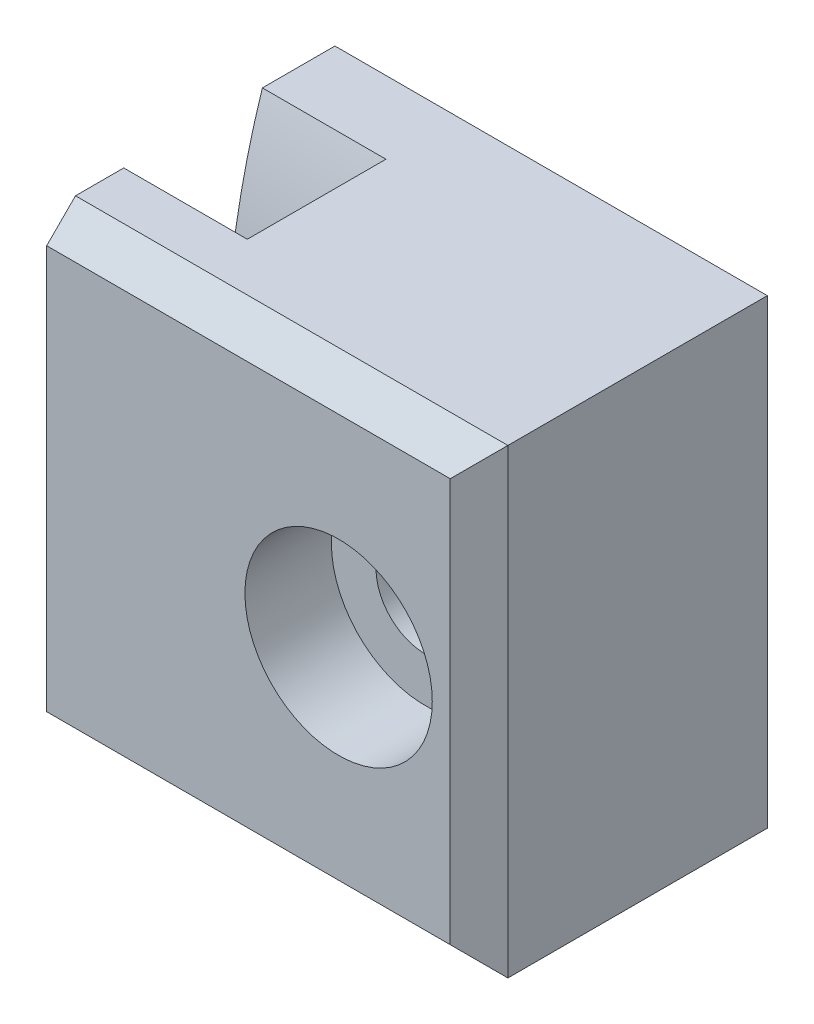
ISO-10303-21;
HEADER;
FILE_DESCRIPTION(('STEP AP214'),'2;1');
FILE_NAME('part.step','',(''),(''),'','','');
FILE_SCHEMA(('AUTOMOTIVE_DESIGN { 1 0 10303 214 1 1 1 1 }'));
ENDSEC;
DATA;
#1=APPLICATION_CONTEXT('core data for automotive mechanical design processes');
#2=APPLICATION_PROTOCOL_DEFINITION('international standard','automotive_design',2000,#1);
#3=PRODUCT_CONTEXT('',#1,'mechanical');
#4=PRODUCT('Part','Part','',(#3));
#5=PRODUCT_RELATED_PRODUCT_CATEGORY('part','',(#4));
#6=PRODUCT_DEFINITION_FORMATION('','',#4);
#7=PRODUCT_DEFINITION_CONTEXT('part definition',#1,'design');
#8=PRODUCT_DEFINITION('design','',#6,#7);
#9=PRODUCT_DEFINITION_SHAPE('','',#8);
#10=(LENGTH_UNIT() NAMED_UNIT(*) SI_UNIT(.MILLI.,.METRE.));
#11=(NAMED_UNIT(*) PLANE_ANGLE_UNIT() SI_UNIT($,.RADIAN.));
#12=(NAMED_UNIT(*) SI_UNIT($,.STERADIAN.) SOLID_ANGLE_UNIT());
#13=UNCERTAINTY_MEASURE_WITH_UNIT(LENGTH_MEASURE(1.E-05),#10,'distance_accuracy_value','');
#14=(GEOMETRIC_REPRESENTATION_CONTEXT(3) GLOBAL_UNCERTAINTY_ASSIGNED_CONTEXT((#13)) GLOBAL_UNIT_ASSIGNED_CONTEXT((#10,
#11,#12)) REPRESENTATION_CONTEXT('',''));
#15=CARTESIAN_POINT('',(0.,0.,0.));
#16=DIRECTION('',(0.,0.,1.));
#17=DIRECTION('',(1.,0.,0.));
#18=AXIS2_PLACEMENT_3D('',#15,#16,#17);
#19=CARTESIAN_POINT('',(0.,8.,9.99999999999991));
#20=DIRECTION('',(0.999999999999999,0.,0.));
#21=DIRECTION('',(0.,0.,-0.999999999999999));
#22=AXIS2_PLACEMENT_3D('',#19,#20,#21);
#23=PLANE('',#22);
#24=DIRECTION('',(0.,0.,-0.999999999999999));
#25=VECTOR('',#24,1.);
#26=CARTESIAN_POINT('',(0.,-8.,9.99999999999991));
#27=LINE('',#26,#25);
#28=CARTESIAN_POINT('',(0.,-8.,2.51673191701997));
#29=VERTEX_POINT('',#28);
#30=CARTESIAN_POINT('',(0.,-8.,0.));
#31=VERTEX_POINT('',#30);
#32=EDGE_CURVE('E178',#29,#31,#27,.T.);
#33=ORIENTED_EDGE('',*,*,#32,.F.);
#34=CARTESIAN_POINT('',(0.,0.,-22.0000000000003));
#35=DIRECTION('',(0.999999999999999,0.,0.));
#36=DIRECTION('',(0.,0.,-0.999999999999999));
#37=AXIS2_PLACEMENT_3D('',#34,#35,#36);
#38=CIRCLE('',#37,25.788953912306);
#39=CARTESIAN_POINT('',(0.,8.,2.51673191701997));
#40=VERTEX_POINT('',#39);
#41=EDGE_CURVE('E121',#29,#40,#38,.F.);
#42=ORIENTED_EDGE('',*,*,#41,.T.);
#43=DIRECTION('',(0.,0.,-0.999999999999999));
#44=VECTOR('',#43,1.);
#45=CARTESIAN_POINT('',(0.,8.,9.99999999999991));
#46=LINE('',#45,#44);
#47=CARTESIAN_POINT('',(0.,8.,0.));
#48=VERTEX_POINT('',#47);
#49=EDGE_CURVE('E159',#40,#48,#46,.T.);
#50=ORIENTED_EDGE('',*,*,#49,.T.);
#51=DIRECTION('',(0.,-1.,0.));
#52=VECTOR('',#51,1.);
#53=CARTESIAN_POINT('',(0.,8.,0.));
#54=LINE('',#53,#52);
#55=EDGE_CURVE('E155',#48,#31,#54,.T.);
#56=ORIENTED_EDGE('',*,*,#55,.T.);
#57=EDGE_LOOP('',(#33,#42,#50,#56));
#58=FACE_BOUND('',#57,.T.);
#59=ADVANCED_FACE('F32',(#58),#23,.F.);
#60=CARTESIAN_POINT('',(0.,8.,8.99999999999994));
#61=VERTEX_POINT('',#60);
#62=CARTESIAN_POINT('',(0.,8.,7.32589644997324));
#63=VERTEX_POINT('',#62);
#64=EDGE_CURVE('E171',#61,#63,#46,.T.);
#65=ORIENTED_EDGE('',*,*,#64,.T.);
#66=CARTESIAN_POINT('',(0.,0.,-22.0000000000003));
#67=DIRECTION('',(0.999999999999999,0.,0.));
#68=DIRECTION('',(0.,0.,-0.999999999999999));
#69=AXIS2_PLACEMENT_3D('',#66,#67,#68);
#70=CIRCLE('',#69,30.3975032296169);
#71=CARTESIAN_POINT('',(0.,-8.,7.32589644997325));
#72=VERTEX_POINT('',#71);
#73=EDGE_CURVE('E134',#63,#72,#70,.T.);
#74=ORIENTED_EDGE('',*,*,#73,.T.);
#75=CARTESIAN_POINT('',(0.,-8.,8.99999999999998));
#76=VERTEX_POINT('',#75);
#77=EDGE_CURVE('E133',#76,#72,#27,.T.);
#78=ORIENTED_EDGE('',*,*,#77,.F.);
#79=DIRECTION('',(0.,0.707106781186548,0.707106781186547));
#80=VECTOR('',#79,1.);
#81=CARTESIAN_POINT('',(0.,-7.,9.99999999999991));
#82=LINE('',#81,#80);
#83=CARTESIAN_POINT('',(0.,-7.,9.99999999999993));
#84=VERTEX_POINT('',#83);
#85=EDGE_CURVE('E188',#76,#84,#82,.T.);
#86=ORIENTED_EDGE('',*,*,#85,.T.);
#87=DIRECTION('',(0.,-1.,0.));
#88=VECTOR('',#87,1.);
#89=CARTESIAN_POINT('',(0.,8.,9.99999999999991));
#90=LINE('',#89,#88);
#91=CARTESIAN_POINT('',(0.,6.99999999999999,9.99999999999991));
#92=VERTEX_POINT('',#91);
#93=EDGE_CURVE('E156',#92,#84,#90,.T.);
#94=ORIENTED_EDGE('',*,*,#93,.F.);
#95=DIRECTION('',(0.,0.707106781186548,-0.707106781186548));
#96=VECTOR('',#95,1.);
#97=CARTESIAN_POINT('',(0.,6.99999999999999,9.99999999999991));
#98=LINE('',#97,#96);
#99=EDGE_CURVE('E186',#92,#61,#98,.T.);
#100=ORIENTED_EDGE('',*,*,#99,.T.);
#101=EDGE_LOOP('',(#65,#74,#78,#86,#94,#100));
#102=FACE_BOUND('',#101,.T.);
#103=ADVANCED_FACE('F219',(#102),#23,.F.);
#104=CARTESIAN_POINT('',(0.,-8.,9.99999999999991));
#105=DIRECTION('',(0.,1.,0.));
#106=DIRECTION('',(0.,0.,0.999999999999999));
#107=AXIS2_PLACEMENT_3D('',#104,#105,#106);
#108=PLANE('',#107);
#109=DIRECTION('',(0.,0.,-0.999999999999999));
#110=VECTOR('',#109,1.);
#111=CARTESIAN_POINT('',(4.28570155742139,-8.,9.99999999999995));
#112=LINE('',#111,#110);
#113=CARTESIAN_POINT('',(4.28570155742135,-8.,7.32589644997324));
#114=VERTEX_POINT('',#113);
#115=CARTESIAN_POINT('',(4.28570155742137,-8.,2.51673191702002));
#116=VERTEX_POINT('',#115);
#117=EDGE_CURVE('E111',#114,#116,#112,.T.);
#118=ORIENTED_EDGE('',*,*,#117,.T.);
#119=DIRECTION('',(-0.999999999999999,0.,0.));
#120=VECTOR('',#119,1.);
#121=CARTESIAN_POINT('',(6.58032539554299,-8.,2.51673191702004));
#122=LINE('',#121,#120);
#123=EDGE_CURVE('E141',#116,#29,#122,.T.);
#124=ORIENTED_EDGE('',*,*,#123,.T.);
#125=ORIENTED_EDGE('',*,*,#32,.T.);
#126=DIRECTION('',(0.999999999999999,0.,0.));
#127=VECTOR('',#126,1.);
#128=CARTESIAN_POINT('',(0.,-8.,0.));
#129=LINE('',#128,#127);
#130=CARTESIAN_POINT('',(15.,-8.,0.));
#131=VERTEX_POINT('',#130);
#132=EDGE_CURVE('E163',#31,#131,#129,.T.);
#133=ORIENTED_EDGE('',*,*,#132,.T.);
#134=DIRECTION('',(0.,0.,-0.999999999999999));
#135=VECTOR('',#134,1.);
#136=CARTESIAN_POINT('',(15.,-8.,9.99999999999999));
#137=LINE('',#136,#135);
#138=CARTESIAN_POINT('',(15.,-8.,8.99999999999999));
#139=VERTEX_POINT('',#138);
#140=EDGE_CURVE('E176',#139,#131,#137,.T.);
#141=ORIENTED_EDGE('',*,*,#140,.F.);
#142=DIRECTION('',(-0.999999999999999,0.,0.));
#143=VECTOR('',#142,1.);
#144=CARTESIAN_POINT('',(0.,-8.,8.99999999999998));
#145=LINE('',#144,#143);
#146=EDGE_CURVE('E184',#139,#76,#145,.T.);
#147=ORIENTED_EDGE('',*,*,#146,.T.);
#148=ORIENTED_EDGE('',*,*,#77,.T.);
#149=DIRECTION('',(-0.999999999999999,0.,0.));
#150=VECTOR('',#149,1.);
#151=CARTESIAN_POINT('',(6.58032539554303,-8.,7.32589644997321));
#152=LINE('',#151,#150);
#153=EDGE_CURVE('E122',#72,#114,#152,.F.);
#154=ORIENTED_EDGE('',*,*,#153,.T.);
#155=EDGE_LOOP('',(#118,#124,#125,#133,#141,#147,#148,#154));
#156=FACE_BOUND('',#155,.T.);
#157=ADVANCED_FACE('F131',(#156),#108,.F.);
#158=CARTESIAN_POINT('',(15.,8.,9.99999999999999));
#159=DIRECTION('',(-0.999999999999999,0.,0.));
#160=DIRECTION('',(0.,0.,0.999999999999999));
#161=AXIS2_PLACEMENT_3D('',#158,#159,#160);
#162=PLANE('',#161);
#163=DIRECTION('',(0.,0.,-0.999999999999999));
#164=VECTOR('',#163,1.);
#165=CARTESIAN_POINT('',(15.,8.,9.99999999999999));
#166=LINE('',#165,#164);
#167=CARTESIAN_POINT('',(15.,8.,8.99999999999999));
#168=VERTEX_POINT('',#167);
#169=CARTESIAN_POINT('',(15.,8.,0.));
#170=VERTEX_POINT('',#169);
#171=EDGE_CURVE('E174',#168,#170,#166,.T.);
#172=ORIENTED_EDGE('',*,*,#171,.F.);
#173=DIRECTION('',(0.,-1.,0.));
#174=VECTOR('',#173,1.);
#175=CARTESIAN_POINT('',(15.,-7.,8.99999999999999));
#176=LINE('',#175,#174);
#177=EDGE_CURVE('E40',#168,#139,#176,.T.);
#178=ORIENTED_EDGE('',*,*,#177,.T.);
#179=ORIENTED_EDGE('',*,*,#140,.T.);
#180=DIRECTION('',(0.,1.,0.));
#181=VECTOR('',#180,1.);
#182=CARTESIAN_POINT('',(15.,8.,0.));
#183=LINE('',#182,#181);
#184=EDGE_CURVE('E166',#131,#170,#183,.T.);
#185=ORIENTED_EDGE('',*,*,#184,.T.);
#186=EDGE_LOOP('',(#172,#178,#179,#185));
#187=FACE_BOUND('',#186,.T.);
#188=ADVANCED_FACE('F204',(#187),#162,.F.);
#189=CARTESIAN_POINT('',(0.,8.,9.99999999999991));
#190=DIRECTION('',(0.,-1.,0.));
#191=DIRECTION('',(0.,0.,-0.999999999999999));
#192=AXIS2_PLACEMENT_3D('',#189,#190,#191);
#193=PLANE('',#192);
#194=ORIENTED_EDGE('',*,*,#49,.F.);
#195=DIRECTION('',(-0.999999999999999,0.,0.));
#196=VECTOR('',#195,1.);
#197=CARTESIAN_POINT('',(6.58032539554299,8.,2.51673191701997));
#198=LINE('',#197,#196);
#199=CARTESIAN_POINT('',(4.28570155742138,8.,2.51673191702002));
#200=VERTEX_POINT('',#199);
#201=EDGE_CURVE('E196',#40,#200,#198,.F.);
#202=ORIENTED_EDGE('',*,*,#201,.T.);
#203=DIRECTION('',(0.,0.,0.999999999999999));
#204=VECTOR('',#203,1.);
#205=CARTESIAN_POINT('',(4.28570155742139,8.,9.99999999999995));
#206=LINE('',#205,#204);
#207=CARTESIAN_POINT('',(4.28570155742135,8.,7.32589644997324));
#208=VERTEX_POINT('',#207);
#209=EDGE_CURVE('E194',#200,#208,#206,.T.);
#210=ORIENTED_EDGE('',*,*,#209,.T.);
#211=DIRECTION('',(-0.999999999999999,0.,0.));
#212=VECTOR('',#211,1.);
#213=CARTESIAN_POINT('',(6.58032539554303,8.,7.32589644997321));
#214=LINE('',#213,#212);
#215=EDGE_CURVE('E128',#208,#63,#214,.T.);
#216=ORIENTED_EDGE('',*,*,#215,.T.);
#217=ORIENTED_EDGE('',*,*,#64,.F.);
#218=DIRECTION('',(0.999999999999999,0.,0.));
#219=VECTOR('',#218,1.);
#220=CARTESIAN_POINT('',(15.,8.,8.99999999999999));
#221=LINE('',#220,#219);
#222=EDGE_CURVE('E190',#61,#168,#221,.T.);
#223=ORIENTED_EDGE('',*,*,#222,.T.);
#224=ORIENTED_EDGE('',*,*,#171,.T.);
#225=DIRECTION('',(-0.999999999999999,0.,0.));
#226=VECTOR('',#225,1.);
#227=CARTESIAN_POINT('',(0.,8.,0.));
#228=LINE('',#227,#226);
#229=EDGE_CURVE('E160',#170,#48,#228,.T.);
#230=ORIENTED_EDGE('',*,*,#229,.T.);
#231=EDGE_LOOP('',(#194,#202,#210,#216,#217,#223,#224,#230));
#232=FACE_BOUND('',#231,.T.);
#233=ADVANCED_FACE('F222',(#232),#193,.F.);
#234=CARTESIAN_POINT('',(0.,-8.,9.99999999999991));
#235=DIRECTION('',(0.,0.,0.999999999999999));
#236=DIRECTION('',(0.999999999999999,0.,0.));
#237=AXIS2_PLACEMENT_3D('',#234,#235,#236);
#238=PLANE('',#237);
#239=CARTESIAN_POINT('',(10.1268774956348,0.,9.99999999999999));
#240=DIRECTION('',(0.,0.,0.999999999999999));
#241=DIRECTION('',(0.999999999999999,0.,0.));
#242=AXIS2_PLACEMENT_3D('',#239,#240,#241);
#243=CIRCLE('',#242,3.25);
#244=CARTESIAN_POINT('',(13.3768774956348,0.,9.99999999999999));
#245=VERTEX_POINT('',#244);
#246=EDGE_CURVE('E152',#245,#245,#243,.T.);
#247=ORIENTED_EDGE('',*,*,#246,.F.);
#248=EDGE_LOOP('',(#247));
#249=FACE_BOUND('',#248,.T.);
#250=DIRECTION('',(0.999999999999999,0.,0.));
#251=VECTOR('',#250,1.);
#252=CARTESIAN_POINT('',(15.,-7.,9.99999999999999));
#253=LINE('',#252,#251);
#254=CARTESIAN_POINT('',(14.,-7.,9.99999999999999));
#255=VERTEX_POINT('',#254);
#256=EDGE_CURVE('E182',#84,#255,#253,.T.);
#257=ORIENTED_EDGE('',*,*,#256,.T.);
#258=DIRECTION('',(0.,1.,0.));
#259=VECTOR('',#258,1.);
#260=CARTESIAN_POINT('',(14.,6.99999999999999,9.99999999999991));
#261=LINE('',#260,#259);
#262=CARTESIAN_POINT('',(14.,6.99999999999999,9.99999999999991));
#263=VERTEX_POINT('',#262);
#264=EDGE_CURVE('E199',#255,#263,#261,.T.);
#265=ORIENTED_EDGE('',*,*,#264,.T.);
#266=DIRECTION('',(-0.999999999999999,0.,0.));
#267=VECTOR('',#266,1.);
#268=CARTESIAN_POINT('',(0.,6.99999999999999,9.99999999999991));
#269=LINE('',#268,#267);
#270=EDGE_CURVE('E180',#263,#92,#269,.T.);
#271=ORIENTED_EDGE('',*,*,#270,.T.);
#272=ORIENTED_EDGE('',*,*,#93,.T.);
#273=EDGE_LOOP('',(#257,#265,#271,#272));
#274=FACE_BOUND('',#273,.T.);
#275=ADVANCED_FACE('F211',(#249,#274),#238,.T.);
#276=CARTESIAN_POINT('',(0.,-8.,0.));
#277=DIRECTION('',(0.,0.,0.999999999999999));
#278=DIRECTION('',(0.999999999999999,0.,0.));
#279=AXIS2_PLACEMENT_3D('',#276,#277,#278);
#280=PLANE('',#279);
#281=CARTESIAN_POINT('',(10.1268774956348,0.,0.));
#282=DIRECTION('',(0.,0.,0.999999999999999));
#283=DIRECTION('',(0.999999999999999,0.,0.));
#284=AXIS2_PLACEMENT_3D('',#281,#282,#283);
#285=CIRCLE('',#284,1.7);
#286=CARTESIAN_POINT('',(11.8268774956348,0.,0.));
#287=VERTEX_POINT('',#286);
#288=EDGE_CURVE('E143',#287,#287,#285,.T.);
#289=ORIENTED_EDGE('',*,*,#288,.T.);
#290=EDGE_LOOP('',(#289));
#291=FACE_BOUND('',#290,.T.);
#292=ORIENTED_EDGE('',*,*,#55,.F.);
#293=ORIENTED_EDGE('',*,*,#229,.F.);
#294=ORIENTED_EDGE('',*,*,#184,.F.);
#295=ORIENTED_EDGE('',*,*,#132,.F.);
#296=EDGE_LOOP('',(#292,#293,#294,#295));
#297=FACE_BOUND('',#296,.T.);
#298=ADVANCED_FACE('F230',(#291,#297),#280,.F.);
#299=CARTESIAN_POINT('',(0.,-7.,9.99999999999991));
#300=DIRECTION('',(0.,-0.707106781186547,0.707106781186547));
#301=DIRECTION('',(0.,-0.707106781186548,-0.707106781186547));
#302=AXIS2_PLACEMENT_3D('',#299,#300,#301);
#303=PLANE('',#302);
#304=ORIENTED_EDGE('',*,*,#146,.F.);
#305=DIRECTION('',(-0.577350269189623,0.577350269189626,0.577350269189626));
#306=VECTOR('',#305,1.);
#307=CARTESIAN_POINT('',(9.33333333333335,-2.33333333333335,14.6666666666666));
#308=LINE('',#307,#306);
#309=EDGE_CURVE('E11',#139,#255,#308,.T.);
#310=ORIENTED_EDGE('',*,*,#309,.T.);
#311=ORIENTED_EDGE('',*,*,#256,.F.);
#312=ORIENTED_EDGE('',*,*,#85,.F.);
#313=EDGE_LOOP('',(#304,#310,#311,#312));
#314=FACE_BOUND('',#313,.T.);
#315=ADVANCED_FACE('F208',(#314),#303,.T.);
#316=CARTESIAN_POINT('',(0.,6.99999999999999,9.99999999999991));
#317=DIRECTION('',(0.,0.707106781186547,0.707106781186547));
#318=DIRECTION('',(0.,-0.707106781186548,0.707106781186548));
#319=AXIS2_PLACEMENT_3D('',#316,#317,#318);
#320=PLANE('',#319);
#321=ORIENTED_EDGE('',*,*,#270,.F.);
#322=DIRECTION('',(0.577350269189624,0.577350269189626,-0.577350269189626));
#323=VECTOR('',#322,1.);
#324=CARTESIAN_POINT('',(9.33333333333335,2.33333333333334,14.6666666666666));
#325=LINE('',#324,#323);
#326=EDGE_CURVE('E47',#263,#168,#325,.T.);
#327=ORIENTED_EDGE('',*,*,#326,.T.);
#328=ORIENTED_EDGE('',*,*,#222,.F.);
#329=ORIENTED_EDGE('',*,*,#99,.F.);
#330=EDGE_LOOP('',(#321,#327,#328,#329));
#331=FACE_BOUND('',#330,.T.);
#332=ADVANCED_FACE('F214',(#331),#320,.T.);
#333=CARTESIAN_POINT('',(10.1268774956348,0.,9.99999999999999));
#334=DIRECTION('',(0.,0.,0.999999999999999));
#335=DIRECTION('',(0.999999999999999,0.,0.));
#336=AXIS2_PLACEMENT_3D('',#333,#334,#335);
#337=CYLINDRICAL_SURFACE('',#336,3.25);
#338=CARTESIAN_POINT('',(10.1268774956348,0.,6.99999999999999));
#339=DIRECTION('',(0.,0.,0.999999999999999));
#340=DIRECTION('',(0.999999999999999,0.,0.));
#341=AXIS2_PLACEMENT_3D('',#338,#339,#340);
#342=CIRCLE('',#341,3.25);
#343=CARTESIAN_POINT('',(13.3768774956348,0.,6.99999999999999));
#344=VERTEX_POINT('',#343);
#345=EDGE_CURVE('E149',#344,#344,#342,.T.);
#346=CARTESIAN_POINT('',(13.3768774956348,0.,6.99999999999999));
#347=CARTESIAN_POINT('',(13.3768774956348,0.,7.03124999999999));
#348=CARTESIAN_POINT('',(13.3768774956348,0.,7.06249999999999));
#349=CARTESIAN_POINT('',(13.3768774956348,0.,7.12499999999999));
#350=CARTESIAN_POINT('',(13.3768774956348,0.,7.15624999999999));
#351=CARTESIAN_POINT('',(13.3768774956348,0.,7.21874999999999));
#352=CARTESIAN_POINT('',(13.3768774956348,0.,7.24999999999999));
#353=CARTESIAN_POINT('',(13.3768774956348,0.,7.31249999999999));
#354=CARTESIAN_POINT('',(13.3768774956348,0.,7.34374999999999));
#355=CARTESIAN_POINT('',(13.3768774956348,0.,7.40624999999999));
#356=CARTESIAN_POINT('',(13.3768774956348,0.,7.43749999999999));
#357=CARTESIAN_POINT('',(13.3768774956348,0.,7.49999999999999));
#358=CARTESIAN_POINT('',(13.3768774956348,0.,7.53124999999999));
#359=CARTESIAN_POINT('',(13.3768774956348,0.,7.59374999999999));
#360=CARTESIAN_POINT('',(13.3768774956348,0.,7.62499999999999));
#361=CARTESIAN_POINT('',(13.3768774956348,0.,7.68749999999999));
#362=CARTESIAN_POINT('',(13.3768774956348,0.,7.71874999999999));
#363=CARTESIAN_POINT('',(13.3768774956348,0.,7.78124999999999));
#364=CARTESIAN_POINT('',(13.3768774956348,0.,7.81249999999999));
#365=CARTESIAN_POINT('',(13.3768774956348,0.,7.87499999999999));
#366=CARTESIAN_POINT('',(13.3768774956348,0.,7.90624999999999));
#367=CARTESIAN_POINT('',(13.3768774956348,0.,7.96874999999999));
#368=CARTESIAN_POINT('',(13.3768774956348,0.,7.99999999999999));
#369=CARTESIAN_POINT('',(13.3768774956348,0.,8.06249999999999));
#370=CARTESIAN_POINT('',(13.3768774956348,0.,8.09374999999999));
#371=CARTESIAN_POINT('',(13.3768774956348,0.,8.15624999999999));
#372=CARTESIAN_POINT('',(13.3768774956348,0.,8.18749999999999));
#373=CARTESIAN_POINT('',(13.3768774956348,0.,8.24999999999999));
#374=CARTESIAN_POINT('',(13.3768774956348,0.,8.28124999999999));
#375=CARTESIAN_POINT('',(13.3768774956348,0.,8.34374999999999));
#376=CARTESIAN_POINT('',(13.3768774956348,0.,8.37499999999999));
#377=CARTESIAN_POINT('',(13.3768774956348,0.,8.43749999999999));
#378=CARTESIAN_POINT('',(13.3768774956348,0.,8.46874999999999));
#379=CARTESIAN_POINT('',(13.3768774956348,0.,8.53124999999999));
#380=CARTESIAN_POINT('',(13.3768774956348,0.,8.56249999999999));
#381=CARTESIAN_POINT('',(13.3768774956348,0.,8.62499999999999));
#382=CARTESIAN_POINT('',(13.3768774956348,0.,8.65624999999999));
#383=CARTESIAN_POINT('',(13.3768774956348,0.,8.71874999999999));
#384=CARTESIAN_POINT('',(13.3768774956348,0.,8.74999999999999));
#385=CARTESIAN_POINT('',(13.3768774956348,0.,8.81249999999999));
#386=CARTESIAN_POINT('',(13.3768774956348,0.,8.84374999999999));
#387=CARTESIAN_POINT('',(13.3768774956348,0.,8.90624999999999));
#388=CARTESIAN_POINT('',(13.3768774956348,0.,8.93749999999999));
#389=CARTESIAN_POINT('',(13.3768774956348,0.,8.99999999999999));
#390=CARTESIAN_POINT('',(13.3768774956348,0.,9.03124999999999));
#391=CARTESIAN_POINT('',(13.3768774956348,0.,9.09374999999999));
#392=CARTESIAN_POINT('',(13.3768774956348,0.,9.12499999999999));
#393=CARTESIAN_POINT('',(13.3768774956348,0.,9.18749999999999));
#394=CARTESIAN_POINT('',(13.3768774956348,0.,9.21874999999999));
#395=CARTESIAN_POINT('',(13.3768774956348,0.,9.28124999999999));
#396=CARTESIAN_POINT('',(13.3768774956348,0.,9.31249999999999));
#397=CARTESIAN_POINT('',(13.3768774956348,0.,9.37499999999999));
#398=CARTESIAN_POINT('',(13.3768774956348,0.,9.40624999999999));
#399=CARTESIAN_POINT('',(13.3768774956348,0.,9.46874999999999));
#400=CARTESIAN_POINT('',(13.3768774956348,0.,9.49999999999999));
#401=CARTESIAN_POINT('',(13.3768774956348,0.,9.56249999999999));
#402=CARTESIAN_POINT('',(13.3768774956348,0.,9.59374999999999));
#403=CARTESIAN_POINT('',(13.3768774956348,0.,9.65624999999999));
#404=CARTESIAN_POINT('',(13.3768774956348,0.,9.68749999999999));
#405=CARTESIAN_POINT('',(13.3768774956348,0.,9.74999999999999));
#406=CARTESIAN_POINT('',(13.3768774956348,0.,9.78124999999999));
#407=CARTESIAN_POINT('',(13.3768774956348,0.,9.84374999999999));
#408=CARTESIAN_POINT('',(13.3768774956348,0.,9.87499999999999));
#409=CARTESIAN_POINT('',(13.3768774956348,0.,9.93749999999999));
#410=CARTESIAN_POINT('',(13.3768774956348,0.,9.96874999999999));
#411=CARTESIAN_POINT('',(13.3768774956348,0.,9.99999999999999));
#412=B_SPLINE_CURVE_WITH_KNOTS('',3,(#346,#347,#348,#349,#350,#351,#352,#353,#354,#355,#356,
#357,#358,#359,#360,#361,#362,#363,#364,#365,#366,#367,#368,#369,#370,#371,#372,#373,#374,#375,
#376,#377,#378,#379,#380,#381,#382,#383,#384,#385,#386,#387,#388,#389,#390,#391,#392,#393,#394,
#395,#396,#397,#398,#399,#400,#401,#402,#403,#404,#405,#406,#407,#408,#409,#410,#411),
.UNSPECIFIED.,.F.,.F.,(4,2,2,2,2,2,2,2,2,2,2,2,2,2,2,2,2,2,2,2,2,2,2,2,2,2,2,2,2,2,2,2,4),(0.,
0.0937499999999992,0.187499999999999,0.281249999999999,0.374999999999999,0.46875,0.5625,
0.656250000000001,0.75,0.843750000000001,0.937500000000001,1.03125,1.125,1.21875,1.3125,1.40625,
1.5,1.59375,1.6875,1.78125,1.875,1.96875,2.0625,2.15625,2.25,2.34375,2.4375,2.53125,2.625,
2.71875,2.8125,2.90625,3.),.UNSPECIFIED.);
#413=EDGE_CURVE('BSEAM250',#344,#245,#412,.T.);
#414=ORIENTED_EDGE('',*,*,#345,.F.);
#415=ORIENTED_EDGE('',*,*,#246,.T.);
#416=ORIENTED_EDGE('',*,*,#413,.T.);
#417=ORIENTED_EDGE('',*,*,#413,.F.);
#418=EDGE_LOOP('',(#414,#416,#415,#417));
#419=FACE_BOUND('',#418,.T.);
#420=ADVANCED_FACE('F250',(#419),#337,.F.);
#421=CARTESIAN_POINT('',(11.8268774956349,0.,6.99999999999995));
#422=DIRECTION('',(0.,0.,-0.999999999999999));
#423=DIRECTION('',(-0.999999999999999,0.,0.));
#424=AXIS2_PLACEMENT_3D('',#421,#422,#423);
#425=PLANE('',#424);
#426=CARTESIAN_POINT('',(10.1268774956348,0.,6.99999999999999));
#427=DIRECTION('',(0.,0.,0.999999999999999));
#428=DIRECTION('',(0.999999999999999,0.,0.));
#429=AXIS2_PLACEMENT_3D('',#426,#427,#428);
#430=CIRCLE('',#429,1.7);
#431=CARTESIAN_POINT('',(11.8268774956348,0.,6.99999999999999));
#432=VERTEX_POINT('',#431);
#433=EDGE_CURVE('E146',#432,#432,#430,.T.);
#434=ORIENTED_EDGE('',*,*,#433,.F.);
#435=EDGE_LOOP('',(#434));
#436=FACE_BOUND('',#435,.T.);
#437=ORIENTED_EDGE('',*,*,#345,.T.);
#438=EDGE_LOOP('',(#437));
#439=FACE_BOUND('',#438,.T.);
#440=ADVANCED_FACE('F254',(#436,#439),#425,.F.);
#441=CARTESIAN_POINT('',(10.1268774956348,0.,9.99999999999999));
#442=DIRECTION('',(0.,0.,0.999999999999999));
#443=DIRECTION('',(0.999999999999999,0.,0.));
#444=AXIS2_PLACEMENT_3D('',#441,#442,#443);
#445=CYLINDRICAL_SURFACE('',#444,1.7);
#446=CARTESIAN_POINT('',(11.8268774956348,0.,0.));
#447=CARTESIAN_POINT('',(11.8268774956348,0.,0.0729166666666666));
#448=CARTESIAN_POINT('',(11.8268774956348,0.,0.145833333333333));
#449=CARTESIAN_POINT('',(11.8268774956348,0.,0.291666666666667));
#450=CARTESIAN_POINT('',(11.8268774956348,0.,0.364583333333334));
#451=CARTESIAN_POINT('',(11.8268774956348,0.,0.510416666666667));
#452=CARTESIAN_POINT('',(11.8268774956348,0.,0.583333333333334));
#453=CARTESIAN_POINT('',(11.8268774956348,0.,0.729166666666667));
#454=CARTESIAN_POINT('',(11.8268774956348,0.,0.802083333333333));
#455=CARTESIAN_POINT('',(11.8268774956348,0.,0.947916666666665));
#456=CARTESIAN_POINT('',(11.8268774956348,0.,1.02083333333333));
#457=CARTESIAN_POINT('',(11.8268774956348,0.,1.16666666666666));
#458=CARTESIAN_POINT('',(11.8268774956348,0.,1.23958333333333));
#459=CARTESIAN_POINT('',(11.8268774956348,0.,1.38541666666666));
#460=CARTESIAN_POINT('',(11.8268774956348,0.,1.45833333333333));
#461=CARTESIAN_POINT('',(11.8268774956348,0.,1.60416666666666));
#462=CARTESIAN_POINT('',(11.8268774956348,0.,1.67708333333333));
#463=CARTESIAN_POINT('',(11.8268774956348,0.,1.82291666666666));
#464=CARTESIAN_POINT('',(11.8268774956348,0.,1.89583333333333));
#465=CARTESIAN_POINT('',(11.8268774956348,0.,2.04166666666666));
#466=CARTESIAN_POINT('',(11.8268774956348,0.,2.11458333333333));
#467=CARTESIAN_POINT('',(11.8268774956348,0.,2.26041666666666));
#468=CARTESIAN_POINT('',(11.8268774956348,0.,2.33333333333333));
#469=CARTESIAN_POINT('',(11.8268774956348,0.,2.47916666666666));
#470=CARTESIAN_POINT('',(11.8268774956348,0.,2.55208333333333));
#471=CARTESIAN_POINT('',(11.8268774956348,0.,2.69791666666666));
#472=CARTESIAN_POINT('',(11.8268774956348,0.,2.77083333333333));
#473=CARTESIAN_POINT('',(11.8268774956348,0.,2.91666666666666));
#474=CARTESIAN_POINT('',(11.8268774956348,0.,2.98958333333333));
#475=CARTESIAN_POINT('',(11.8268774956348,0.,3.13541666666666));
#476=CARTESIAN_POINT('',(11.8268774956348,0.,3.20833333333333));
#477=CARTESIAN_POINT('',(11.8268774956348,0.,3.35416666666666));
#478=CARTESIAN_POINT('',(11.8268774956348,0.,3.42708333333333));
#479=CARTESIAN_POINT('',(11.8268774956348,0.,3.57291666666666));
#480=CARTESIAN_POINT('',(11.8268774956348,0.,3.64583333333333));
#481=CARTESIAN_POINT('',(11.8268774956348,0.,3.79166666666666));
#482=CARTESIAN_POINT('',(11.8268774956348,0.,3.86458333333333));
#483=CARTESIAN_POINT('',(11.8268774956348,0.,4.01041666666666));
#484=CARTESIAN_POINT('',(11.8268774956348,0.,4.08333333333333));
#485=CARTESIAN_POINT('',(11.8268774956348,0.,4.22916666666666));
#486=CARTESIAN_POINT('',(11.8268774956348,0.,4.30208333333333));
#487=CARTESIAN_POINT('',(11.8268774956348,0.,4.44791666666666));
#488=CARTESIAN_POINT('',(11.8268774956348,0.,4.52083333333333));
#489=CARTESIAN_POINT('',(11.8268774956348,0.,4.66666666666666));
#490=CARTESIAN_POINT('',(11.8268774956348,0.,4.73958333333333));
#491=CARTESIAN_POINT('',(11.8268774956348,0.,4.88541666666666));
#492=CARTESIAN_POINT('',(11.8268774956348,0.,4.95833333333333));
#493=CARTESIAN_POINT('',(11.8268774956348,0.,5.10416666666666));
#494=CARTESIAN_POINT('',(11.8268774956348,0.,5.17708333333333));
#495=CARTESIAN_POINT('',(11.8268774956348,0.,5.32291666666666));
#496=CARTESIAN_POINT('',(11.8268774956348,0.,5.39583333333333));
#497=CARTESIAN_POINT('',(11.8268774956348,0.,5.54166666666666));
#498=CARTESIAN_POINT('',(11.8268774956348,0.,5.61458333333333));
#499=CARTESIAN_POINT('',(11.8268774956348,0.,5.76041666666666));
#500=CARTESIAN_POINT('',(11.8268774956348,0.,5.83333333333333));
#501=CARTESIAN_POINT('',(11.8268774956348,0.,5.97916666666666));
#502=CARTESIAN_POINT('',(11.8268774956348,0.,6.05208333333333));
#503=CARTESIAN_POINT('',(11.8268774956348,0.,6.19791666666666));
#504=CARTESIAN_POINT('',(11.8268774956348,0.,6.27083333333333));
#505=CARTESIAN_POINT('',(11.8268774956348,0.,6.41666666666666));
#506=CARTESIAN_POINT('',(11.8268774956348,0.,6.48958333333333));
#507=CARTESIAN_POINT('',(11.8268774956348,0.,6.63541666666666));
#508=CARTESIAN_POINT('',(11.8268774956348,0.,6.70833333333333));
#509=CARTESIAN_POINT('',(11.8268774956348,0.,6.85416666666666));
#510=CARTESIAN_POINT('',(11.8268774956348,0.,6.92708333333333));
#511=CARTESIAN_POINT('',(11.8268774956348,0.,6.99999999999999));
#512=B_SPLINE_CURVE_WITH_KNOTS('',3,(#446,#447,#448,#449,#450,#451,#452,#453,#454,#455,#456,
#457,#458,#459,#460,#461,#462,#463,#464,#465,#466,#467,#468,#469,#470,#471,#472,#473,#474,#475,
#476,#477,#478,#479,#480,#481,#482,#483,#484,#485,#486,#487,#488,#489,#490,#491,#492,#493,#494,
#495,#496,#497,#498,#499,#500,#501,#502,#503,#504,#505,#506,#507,#508,#509,#510,#511),
.UNSPECIFIED.,.F.,.F.,(4,2,2,2,2,2,2,2,2,2,2,2,2,2,2,2,2,2,2,2,2,2,2,2,2,2,2,2,2,2,2,2,4),(0.,
0.21875,0.4375,0.656250000000001,0.874999999999999,1.09375,1.3125,1.53125,1.75,1.96875,2.1875,
2.40625,2.625,2.84375,3.0625,3.28125,3.5,3.71875,3.9375,4.15624999999999,4.37499999999999,
4.59374999999999,4.81249999999999,5.03124999999999,5.24999999999999,5.46874999999999,
5.68749999999999,5.90624999999999,6.12499999999999,6.34374999999999,6.56249999999999,
6.78124999999999,6.99999999999999),.UNSPECIFIED.);
#513=EDGE_CURVE('BSEAM260',#287,#432,#512,.T.);
#514=ORIENTED_EDGE('',*,*,#288,.F.);
#515=ORIENTED_EDGE('',*,*,#433,.T.);
#516=ORIENTED_EDGE('',*,*,#513,.T.);
#517=ORIENTED_EDGE('',*,*,#513,.F.);
#518=EDGE_LOOP('',(#514,#516,#515,#517));
#519=FACE_BOUND('',#518,.T.);
#520=ADVANCED_FACE('F260',(#519),#445,.F.);
#521=CARTESIAN_POINT('',(6.58032539554299,0.,-22.0000000000003));
#522=DIRECTION('',(-0.999999999999999,0.,0.));
#523=DIRECTION('',(0.,0.,0.999999999999999));
#524=AXIS2_PLACEMENT_3D('',#521,#522,#523);
#525=CYLINDRICAL_SURFACE('',#524,25.788953912306);
#526=CARTESIAN_POINT('',(4.28570155742135,0.,-22.0000000000003));
#527=DIRECTION('',(-0.999999999999999,0.,0.));
#528=DIRECTION('',(0.,0.,0.999999999999999));
#529=AXIS2_PLACEMENT_3D('',#526,#527,#528);
#530=CIRCLE('',#529,25.788953912306);
#531=EDGE_CURVE('E117',#116,#200,#530,.T.);
#532=ORIENTED_EDGE('',*,*,#531,.T.);
#533=ORIENTED_EDGE('',*,*,#201,.F.);
#534=ORIENTED_EDGE('',*,*,#41,.F.);
#535=ORIENTED_EDGE('',*,*,#123,.F.);
#536=EDGE_LOOP('',(#532,#533,#534,#535));
#537=FACE_BOUND('',#536,.T.);
#538=ADVANCED_FACE('F224',(#537),#525,.T.);
#539=CARTESIAN_POINT('',(4.28570155742136,-10.1468950816268,6.6539477698451));
#540=DIRECTION('',(0.999999999999999,0.,0.));
#541=DIRECTION('',(0.,0.,-0.999999999999999));
#542=AXIS2_PLACEMENT_3D('',#539,#540,#541);
#543=PLANE('',#542);
#544=CARTESIAN_POINT('',(4.28570155742135,0.,-22.0000000000003));
#545=DIRECTION('',(-0.999999999999999,0.,0.));
#546=DIRECTION('',(0.,0.,0.999999999999999));
#547=AXIS2_PLACEMENT_3D('',#544,#545,#546);
#548=CIRCLE('',#547,30.3975032296169);
#549=EDGE_CURVE('E114',#114,#208,#548,.T.);
#550=ORIENTED_EDGE('',*,*,#549,.T.);
#551=ORIENTED_EDGE('',*,*,#209,.F.);
#552=ORIENTED_EDGE('',*,*,#531,.F.);
#553=ORIENTED_EDGE('',*,*,#117,.F.);
#554=EDGE_LOOP('',(#550,#551,#552,#553));
#555=FACE_BOUND('',#554,.T.);
#556=ADVANCED_FACE('F113',(#555),#543,.F.);
#557=CARTESIAN_POINT('',(6.58032539554299,0.,-22.0000000000003));
#558=DIRECTION('',(-0.999999999999999,0.,0.));
#559=DIRECTION('',(0.,0.,0.999999999999999));
#560=AXIS2_PLACEMENT_3D('',#557,#558,#559);
#561=CYLINDRICAL_SURFACE('',#560,30.3975032296169);
#562=ORIENTED_EDGE('',*,*,#73,.F.);
#563=ORIENTED_EDGE('',*,*,#215,.F.);
#564=ORIENTED_EDGE('',*,*,#549,.F.);
#565=ORIENTED_EDGE('',*,*,#153,.F.);
#566=EDGE_LOOP('',(#562,#563,#564,#565));
#567=FACE_BOUND('',#566,.T.);
#568=ADVANCED_FACE('F125',(#567),#561,.F.);
#569=CARTESIAN_POINT('',(14.,-8.,9.99999999999991));
#570=DIRECTION('',(0.707106781186549,0.,0.707106781186546));
#571=DIRECTION('',(0.707106781186546,0.,-0.707106781186549));
#572=AXIS2_PLACEMENT_3D('',#569,#570,#571);
#573=PLANE('',#572);
#574=ORIENTED_EDGE('',*,*,#309,.F.);
#575=ORIENTED_EDGE('',*,*,#177,.F.);
#576=ORIENTED_EDGE('',*,*,#326,.F.);
#577=ORIENTED_EDGE('',*,*,#264,.F.);
#578=EDGE_LOOP('',(#574,#575,#576,#577));
#579=FACE_BOUND('',#578,.T.);
#580=ADVANCED_FACE('F34',(#579),#573,.T.);
#581=CLOSED_SHELL('',(#59,#103,#157,#188,#233,#275,#298,#315,#332,#420,#440,#520,#538,#556,#568,#580));
#582=MANIFOLD_SOLID_BREP('B2',#581);
#583=ADVANCED_BREP_SHAPE_REPRESENTATION('',(#18,#582),#14);
#584=SHAPE_DEFINITION_REPRESENTATION(#9,#583);
ENDSEC;
END-ISO-10303-21;
